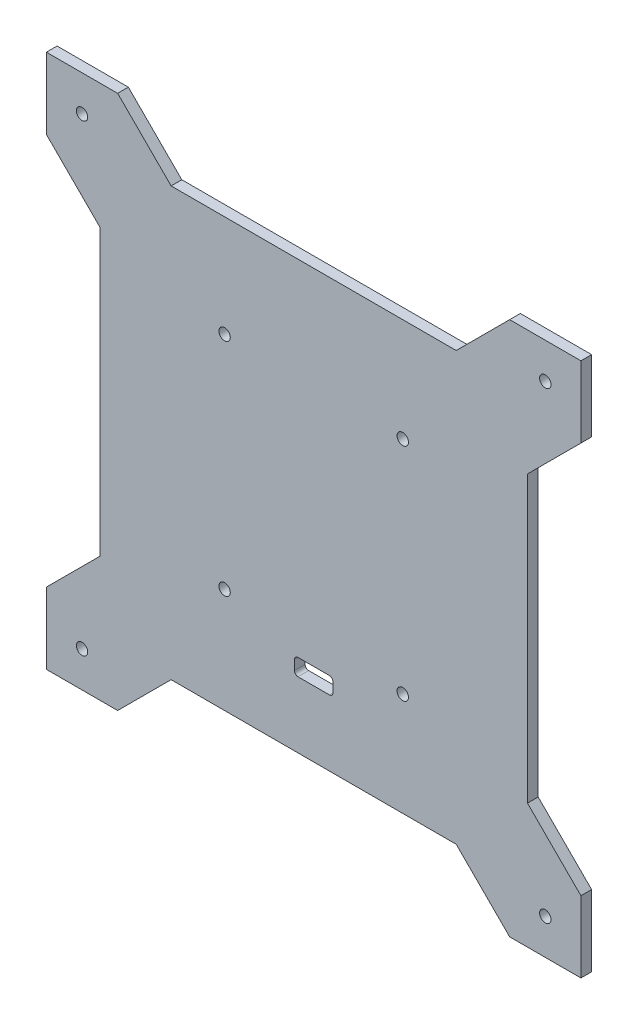
ISO-10303-21;
HEADER;
FILE_DESCRIPTION(('STEP AP214'),'2;1');
FILE_NAME('part.step','',(''),(''),'','','');
FILE_SCHEMA(('AUTOMOTIVE_DESIGN { 1 0 10303 214 1 1 1 1 }'));
ENDSEC;
DATA;
#1=APPLICATION_CONTEXT('core data for automotive mechanical design processes');
#2=APPLICATION_PROTOCOL_DEFINITION('international standard','automotive_design',2000,#1);
#3=PRODUCT_CONTEXT('',#1,'mechanical');
#4=PRODUCT('Part','Part','',(#3));
#5=PRODUCT_RELATED_PRODUCT_CATEGORY('part','',(#4));
#6=PRODUCT_DEFINITION_FORMATION('','',#4);
#7=PRODUCT_DEFINITION_CONTEXT('part definition',#1,'design');
#8=PRODUCT_DEFINITION('design','',#6,#7);
#9=PRODUCT_DEFINITION_SHAPE('','',#8);
#10=(LENGTH_UNIT() NAMED_UNIT(*) SI_UNIT(.MILLI.,.METRE.));
#11=(NAMED_UNIT(*) PLANE_ANGLE_UNIT() SI_UNIT($,.RADIAN.));
#12=(NAMED_UNIT(*) SI_UNIT($,.STERADIAN.) SOLID_ANGLE_UNIT());
#13=UNCERTAINTY_MEASURE_WITH_UNIT(LENGTH_MEASURE(1.E-05),#10,'distance_accuracy_value','');
#14=(GEOMETRIC_REPRESENTATION_CONTEXT(3) GLOBAL_UNCERTAINTY_ASSIGNED_CONTEXT((#13)) GLOBAL_UNIT_ASSIGNED_CONTEXT((#10,
#11,#12)) REPRESENTATION_CONTEXT('',''));
#15=CARTESIAN_POINT('',(0.,0.,0.));
#16=DIRECTION('',(0.,0.,1.));
#17=DIRECTION('',(1.,0.,0.));
#18=AXIS2_PLACEMENT_3D('',#15,#16,#17);
#19=CARTESIAN_POINT('',(75.,-75.,3.));
#20=DIRECTION('',(-1.,0.,0.));
#21=DIRECTION('',(0.,0.,1.));
#22=AXIS2_PLACEMENT_3D('',#19,#20,#21);
#23=PLANE('',#22);
#24=DIRECTION('',(0.,1.,0.));
#25=VECTOR('',#24,1.);
#26=CARTESIAN_POINT('',(75.,-75.,0.));
#27=LINE('',#26,#25);
#28=CARTESIAN_POINT('',(75.,-75.,0.));
#29=VERTEX_POINT('',#28);
#30=CARTESIAN_POINT('',(75.,-55.,0.));
#31=VERTEX_POINT('',#30);
#32=EDGE_CURVE('E458',#29,#31,#27,.T.);
#33=ORIENTED_EDGE('',*,*,#32,.T.);
#34=DIRECTION('',(0.,0.,1.));
#35=VECTOR('',#34,1.);
#36=CARTESIAN_POINT('',(75.,-55.,0.));
#37=LINE('',#36,#35);
#38=CARTESIAN_POINT('',(75.,-55.,3.));
#39=VERTEX_POINT('',#38);
#40=EDGE_CURVE('E299',#31,#39,#37,.T.);
#41=ORIENTED_EDGE('',*,*,#40,.T.);
#42=DIRECTION('',(0.,1.,0.));
#43=VECTOR('',#42,1.);
#44=CARTESIAN_POINT('',(75.,-75.,3.));
#45=LINE('',#44,#43);
#46=CARTESIAN_POINT('',(75.,-75.,3.));
#47=VERTEX_POINT('',#46);
#48=EDGE_CURVE('E441',#47,#39,#45,.T.);
#49=ORIENTED_EDGE('',*,*,#48,.F.);
#50=DIRECTION('',(0.,0.,-1.));
#51=VECTOR('',#50,1.);
#52=CARTESIAN_POINT('',(75.,-75.,3.));
#53=LINE('',#52,#51);
#54=EDGE_CURVE('E457',#47,#29,#53,.T.);
#55=ORIENTED_EDGE('',*,*,#54,.T.);
#56=EDGE_LOOP('',(#33,#41,#49,#55));
#57=FACE_BOUND('',#56,.T.);
#58=ADVANCED_FACE('F35',(#57),#23,.F.);
#59=CARTESIAN_POINT('',(-75.,75.,3.));
#60=DIRECTION('',(0.,-1.,0.));
#61=DIRECTION('',(0.,0.,-1.));
#62=AXIS2_PLACEMENT_3D('',#59,#60,#61);
#63=PLANE('',#62);
#64=DIRECTION('',(-1.,0.,0.));
#65=VECTOR('',#64,1.);
#66=CARTESIAN_POINT('',(-75.,75.,0.));
#67=LINE('',#66,#65);
#68=CARTESIAN_POINT('',(75.,75.,0.));
#69=VERTEX_POINT('',#68);
#70=CARTESIAN_POINT('',(55.,75.,0.));
#71=VERTEX_POINT('',#70);
#72=EDGE_CURVE('E462',#69,#71,#67,.T.);
#73=ORIENTED_EDGE('',*,*,#72,.T.);
#74=DIRECTION('',(0.,0.,1.));
#75=VECTOR('',#74,1.);
#76=CARTESIAN_POINT('',(55.,75.,0.));
#77=LINE('',#76,#75);
#78=CARTESIAN_POINT('',(55.,75.,3.));
#79=VERTEX_POINT('',#78);
#80=EDGE_CURVE('E374',#71,#79,#77,.T.);
#81=ORIENTED_EDGE('',*,*,#80,.T.);
#82=DIRECTION('',(-1.,0.,0.));
#83=VECTOR('',#82,1.);
#84=CARTESIAN_POINT('',(-75.,75.,3.));
#85=LINE('',#84,#83);
#86=CARTESIAN_POINT('',(75.,75.,3.));
#87=VERTEX_POINT('',#86);
#88=EDGE_CURVE('E446',#87,#79,#85,.T.);
#89=ORIENTED_EDGE('',*,*,#88,.F.);
#90=DIRECTION('',(0.,0.,-1.));
#91=VECTOR('',#90,1.);
#92=CARTESIAN_POINT('',(75.,75.,3.));
#93=LINE('',#92,#91);
#94=EDGE_CURVE('E11',#87,#69,#93,.T.);
#95=ORIENTED_EDGE('',*,*,#94,.T.);
#96=EDGE_LOOP('',(#73,#81,#89,#95));
#97=FACE_BOUND('',#96,.T.);
#98=ADVANCED_FACE('F512',(#97),#63,.F.);
#99=CARTESIAN_POINT('',(-75.,-75.,3.));
#100=DIRECTION('',(1.,0.,0.));
#101=DIRECTION('',(0.,0.,-1.));
#102=AXIS2_PLACEMENT_3D('',#99,#100,#101);
#103=PLANE('',#102);
#104=DIRECTION('',(0.,-1.,0.));
#105=VECTOR('',#104,1.);
#106=CARTESIAN_POINT('',(-75.,-75.,0.));
#107=LINE('',#106,#105);
#108=CARTESIAN_POINT('',(-75.,75.,0.));
#109=VERTEX_POINT('',#108);
#110=CARTESIAN_POINT('',(-75.,55.,0.));
#111=VERTEX_POINT('',#110);
#112=EDGE_CURVE('E466',#109,#111,#107,.T.);
#113=ORIENTED_EDGE('',*,*,#112,.T.);
#114=DIRECTION('',(0.,0.,1.));
#115=VECTOR('',#114,1.);
#116=CARTESIAN_POINT('',(-75.,55.,0.));
#117=LINE('',#116,#115);
#118=CARTESIAN_POINT('',(-75.,55.,3.));
#119=VERTEX_POINT('',#118);
#120=EDGE_CURVE('E303',#111,#119,#117,.T.);
#121=ORIENTED_EDGE('',*,*,#120,.T.);
#122=DIRECTION('',(0.,-1.,0.));
#123=VECTOR('',#122,1.);
#124=CARTESIAN_POINT('',(-75.,-75.,3.));
#125=LINE('',#124,#123);
#126=CARTESIAN_POINT('',(-75.,75.,3.));
#127=VERTEX_POINT('',#126);
#128=EDGE_CURVE('E450',#127,#119,#125,.T.);
#129=ORIENTED_EDGE('',*,*,#128,.F.);
#130=DIRECTION('',(0.,0.,-1.));
#131=VECTOR('',#130,1.);
#132=CARTESIAN_POINT('',(-75.,75.,3.));
#133=LINE('',#132,#131);
#134=EDGE_CURVE('E43',#127,#109,#133,.T.);
#135=ORIENTED_EDGE('',*,*,#134,.T.);
#136=EDGE_LOOP('',(#113,#121,#129,#135));
#137=FACE_BOUND('',#136,.T.);
#138=ADVANCED_FACE('F482',(#137),#103,.F.);
#139=CARTESIAN_POINT('',(-75.,-75.,3.));
#140=DIRECTION('',(0.,1.,0.));
#141=DIRECTION('',(0.,0.,1.));
#142=AXIS2_PLACEMENT_3D('',#139,#140,#141);
#143=PLANE('',#142);
#144=DIRECTION('',(1.,0.,0.));
#145=VECTOR('',#144,1.);
#146=CARTESIAN_POINT('',(-75.,-75.,0.));
#147=LINE('',#146,#145);
#148=CARTESIAN_POINT('',(-75.,-75.,0.));
#149=VERTEX_POINT('',#148);
#150=CARTESIAN_POINT('',(-55.,-75.,0.));
#151=VERTEX_POINT('',#150);
#152=EDGE_CURVE('E470',#149,#151,#147,.T.);
#153=ORIENTED_EDGE('',*,*,#152,.T.);
#154=DIRECTION('',(0.,0.,1.));
#155=VECTOR('',#154,1.);
#156=CARTESIAN_POINT('',(-55.,-75.,0.));
#157=LINE('',#156,#155);
#158=CARTESIAN_POINT('',(-55.,-75.,3.));
#159=VERTEX_POINT('',#158);
#160=EDGE_CURVE('E353',#151,#159,#157,.T.);
#161=ORIENTED_EDGE('',*,*,#160,.T.);
#162=DIRECTION('',(1.,0.,0.));
#163=VECTOR('',#162,1.);
#164=CARTESIAN_POINT('',(-75.,-75.,3.));
#165=LINE('',#164,#163);
#166=CARTESIAN_POINT('',(-75.,-75.,3.));
#167=VERTEX_POINT('',#166);
#168=EDGE_CURVE('E454',#167,#159,#165,.T.);
#169=ORIENTED_EDGE('',*,*,#168,.F.);
#170=DIRECTION('',(0.,0.,-1.));
#171=VECTOR('',#170,1.);
#172=CARTESIAN_POINT('',(-75.,-75.,3.));
#173=LINE('',#172,#171);
#174=EDGE_CURVE('E475',#167,#149,#173,.T.);
#175=ORIENTED_EDGE('',*,*,#174,.T.);
#176=EDGE_LOOP('',(#153,#161,#169,#175));
#177=FACE_BOUND('',#176,.T.);
#178=ADVANCED_FACE('F552',(#177),#143,.F.);
#179=CARTESIAN_POINT('',(0.,0.,3.));
#180=DIRECTION('',(0.,0.,-1.));
#181=DIRECTION('',(-1.,0.,0.));
#182=AXIS2_PLACEMENT_3D('',#179,#180,#181);
#183=PLANE('',#182);
#184=DIRECTION('',(1.,0.,0.));
#185=VECTOR('',#184,1.);
#186=CARTESIAN_POINT('',(4.40000000000002,-41.4873019237292,3.));
#187=LINE('',#186,#185);
#188=CARTESIAN_POINT('',(-4.39999999999998,-41.4873019237292,3.));
#189=VERTEX_POINT('',#188);
#190=CARTESIAN_POINT('',(4.40000000000002,-41.4873019237292,3.));
#191=VERTEX_POINT('',#190);
#192=EDGE_CURVE('E259',#189,#191,#187,.T.);
#193=ORIENTED_EDGE('',*,*,#192,.F.);
#194=CARTESIAN_POINT('',(-4.39999999999998,-40.4873019237292,3.));
#195=DIRECTION('',(0.,0.,1.));
#196=DIRECTION('',(1.,0.,0.));
#197=AXIS2_PLACEMENT_3D('',#194,#195,#196);
#198=CIRCLE('',#197,1.);
#199=CARTESIAN_POINT('',(-5.39999999999998,-40.4873019237292,3.));
#200=VERTEX_POINT('',#199);
#201=EDGE_CURVE('E50',#200,#189,#198,.T.);
#202=ORIENTED_EDGE('',*,*,#201,.F.);
#203=DIRECTION('',(0.,-1.,0.));
#204=VECTOR('',#203,1.);
#205=CARTESIAN_POINT('',(-5.39999999999998,-40.4873019237292,3.));
#206=LINE('',#205,#204);
#207=CARTESIAN_POINT('',(-5.39999999999998,-37.7873019237292,3.));
#208=VERTEX_POINT('',#207);
#209=EDGE_CURVE('E239',#208,#200,#206,.T.);
#210=ORIENTED_EDGE('',*,*,#209,.F.);
#211=CARTESIAN_POINT('',(-4.39999999999998,-37.7873019237292,3.));
#212=DIRECTION('',(0.,0.,1.));
#213=DIRECTION('',(1.,0.,0.));
#214=AXIS2_PLACEMENT_3D('',#211,#212,#213);
#215=CIRCLE('',#214,1.);
#216=CARTESIAN_POINT('',(-4.39999999999998,-36.7873019237292,3.));
#217=VERTEX_POINT('',#216);
#218=EDGE_CURVE('E242',#217,#208,#215,.T.);
#219=ORIENTED_EDGE('',*,*,#218,.F.);
#220=DIRECTION('',(-1.,0.,0.));
#221=VECTOR('',#220,1.);
#222=CARTESIAN_POINT('',(-4.39999999999998,-36.7873019237292,3.));
#223=LINE('',#222,#221);
#224=CARTESIAN_POINT('',(4.40000000000002,-36.7873019237292,3.));
#225=VERTEX_POINT('',#224);
#226=EDGE_CURVE('E270',#225,#217,#223,.T.);
#227=ORIENTED_EDGE('',*,*,#226,.F.);
#228=CARTESIAN_POINT('',(4.40000000000002,-37.7873019237292,3.));
#229=DIRECTION('',(0.,0.,1.));
#230=DIRECTION('',(1.,0.,0.));
#231=AXIS2_PLACEMENT_3D('',#228,#229,#230);
#232=CIRCLE('',#231,1.);
#233=CARTESIAN_POINT('',(5.40000000000002,-37.7873019237292,3.));
#234=VERTEX_POINT('',#233);
#235=EDGE_CURVE('E267',#234,#225,#232,.T.);
#236=ORIENTED_EDGE('',*,*,#235,.F.);
#237=DIRECTION('',(0.,1.,0.));
#238=VECTOR('',#237,1.);
#239=CARTESIAN_POINT('',(5.40000000000002,-37.7873019237292,3.));
#240=LINE('',#239,#238);
#241=CARTESIAN_POINT('',(5.40000000000002,-40.4873019237292,3.));
#242=VERTEX_POINT('',#241);
#243=EDGE_CURVE('E264',#242,#234,#240,.T.);
#244=ORIENTED_EDGE('',*,*,#243,.F.);
#245=CARTESIAN_POINT('',(4.40000000000002,-40.4873019237292,3.));
#246=DIRECTION('',(0.,0.,1.));
#247=DIRECTION('',(1.,0.,0.));
#248=AXIS2_PLACEMENT_3D('',#245,#246,#247);
#249=CIRCLE('',#248,1.);
#250=EDGE_CURVE('E261',#191,#242,#249,.T.);
#251=ORIENTED_EDGE('',*,*,#250,.F.);
#252=EDGE_LOOP('',(#193,#202,#210,#219,#227,#236,#244,#251));
#253=FACE_BOUND('',#252,.T.);
#254=CARTESIAN_POINT('',(-25.,31.4660394310522,3.));
#255=DIRECTION('',(0.,0.,1.));
#256=DIRECTION('',(1.,0.,0.));
#257=AXIS2_PLACEMENT_3D('',#254,#255,#256);
#258=CIRCLE('',#257,1.6);
#259=CARTESIAN_POINT('',(-23.4,31.4660394310522,3.));
#260=VERTEX_POINT('',#259);
#261=EDGE_CURVE('E371',#260,#260,#258,.T.);
#262=ORIENTED_EDGE('',*,*,#261,.F.);
#263=EDGE_LOOP('',(#262));
#264=FACE_BOUND('',#263,.T.);
#265=CARTESIAN_POINT('',(25.,31.0000000000001,3.));
#266=DIRECTION('',(0.,0.,1.));
#267=DIRECTION('',(1.,0.,0.));
#268=AXIS2_PLACEMENT_3D('',#265,#266,#267);
#269=CIRCLE('',#268,1.6);
#270=CARTESIAN_POINT('',(26.6,31.0000000000001,3.));
#271=VERTEX_POINT('',#270);
#272=EDGE_CURVE('E370',#271,#271,#269,.T.);
#273=ORIENTED_EDGE('',*,*,#272,.F.);
#274=EDGE_LOOP('',(#273));
#275=FACE_BOUND('',#274,.T.);
#276=CARTESIAN_POINT('',(25.,-30.9999999999999,3.));
#277=DIRECTION('',(0.,0.,1.));
#278=DIRECTION('',(1.,0.,0.));
#279=AXIS2_PLACEMENT_3D('',#276,#277,#278);
#280=CIRCLE('',#279,1.6);
#281=CARTESIAN_POINT('',(26.6,-30.9999999999999,3.));
#282=VERTEX_POINT('',#281);
#283=EDGE_CURVE('E403',#282,#282,#280,.T.);
#284=ORIENTED_EDGE('',*,*,#283,.F.);
#285=EDGE_LOOP('',(#284));
#286=FACE_BOUND('',#285,.T.);
#287=CARTESIAN_POINT('',(-25.,-30.5052227269584,3.));
#288=DIRECTION('',(0.,0.,1.));
#289=DIRECTION('',(1.,0.,0.));
#290=AXIS2_PLACEMENT_3D('',#287,#288,#289);
#291=CIRCLE('',#290,1.6);
#292=CARTESIAN_POINT('',(-23.4,-30.5052227269584,3.));
#293=VERTEX_POINT('',#292);
#294=EDGE_CURVE('E402',#293,#293,#291,.T.);
#295=ORIENTED_EDGE('',*,*,#294,.F.);
#296=EDGE_LOOP('',(#295));
#297=FACE_BOUND('',#296,.T.);
#298=ORIENTED_EDGE('',*,*,#88,.T.);
#299=DIRECTION('',(0.707106781186546,0.707106781186549,0.));
#300=VECTOR('',#299,1.);
#301=CARTESIAN_POINT('',(40.0000000000001,60.,3.));
#302=LINE('',#301,#300);
#303=CARTESIAN_POINT('',(40.0000000000001,60.,3.));
#304=VERTEX_POINT('',#303);
#305=EDGE_CURVE('E379',#304,#79,#302,.T.);
#306=ORIENTED_EDGE('',*,*,#305,.F.);
#307=DIRECTION('',(1.,0.,0.));
#308=VECTOR('',#307,1.);
#309=CARTESIAN_POINT('',(-40.,60.,3.));
#310=LINE('',#309,#308);
#311=CARTESIAN_POINT('',(-40.,60.,3.));
#312=VERTEX_POINT('',#311);
#313=EDGE_CURVE('E388',#312,#304,#310,.T.);
#314=ORIENTED_EDGE('',*,*,#313,.F.);
#315=DIRECTION('',(0.707106781186546,-0.707106781186549,0.));
#316=VECTOR('',#315,1.);
#317=CARTESIAN_POINT('',(-55.,75.,3.));
#318=LINE('',#317,#316);
#319=CARTESIAN_POINT('',(-55.,75.,3.));
#320=VERTEX_POINT('',#319);
#321=EDGE_CURVE('E310',#320,#312,#318,.T.);
#322=ORIENTED_EDGE('',*,*,#321,.F.);
#323=EDGE_CURVE('E444',#320,#127,#85,.T.);
#324=ORIENTED_EDGE('',*,*,#323,.T.);
#325=ORIENTED_EDGE('',*,*,#128,.T.);
#326=DIRECTION('',(-0.707106781186548,0.707106781186547,0.));
#327=VECTOR('',#326,1.);
#328=CARTESIAN_POINT('',(-60.,40.0000000000001,3.));
#329=LINE('',#328,#327);
#330=CARTESIAN_POINT('',(-60.,40.0000000000001,3.));
#331=VERTEX_POINT('',#330);
#332=EDGE_CURVE('E321',#331,#119,#329,.T.);
#333=ORIENTED_EDGE('',*,*,#332,.F.);
#334=DIRECTION('',(0.,1.,0.));
#335=VECTOR('',#334,1.);
#336=CARTESIAN_POINT('',(-60.,-40.,3.));
#337=LINE('',#336,#335);
#338=CARTESIAN_POINT('',(-60.,-40.,3.));
#339=VERTEX_POINT('',#338);
#340=EDGE_CURVE('E331',#339,#331,#337,.T.);
#341=ORIENTED_EDGE('',*,*,#340,.F.);
#342=DIRECTION('',(0.707106781186549,0.707106781186546,0.));
#343=VECTOR('',#342,1.);
#344=CARTESIAN_POINT('',(-75.,-55.,3.));
#345=LINE('',#344,#343);
#346=CARTESIAN_POINT('',(-75.,-55.,3.));
#347=VERTEX_POINT('',#346);
#348=EDGE_CURVE('E328',#347,#339,#345,.T.);
#349=ORIENTED_EDGE('',*,*,#348,.F.);
#350=EDGE_CURVE('E449',#347,#167,#125,.T.);
#351=ORIENTED_EDGE('',*,*,#350,.T.);
#352=ORIENTED_EDGE('',*,*,#168,.T.);
#353=DIRECTION('',(-0.707106781186546,-0.707106781186549,0.));
#354=VECTOR('',#353,1.);
#355=CARTESIAN_POINT('',(-55.,-75.,3.));
#356=LINE('',#355,#354);
#357=CARTESIAN_POINT('',(-40.,-60.,3.));
#358=VERTEX_POINT('',#357);
#359=EDGE_CURVE('E277',#358,#159,#356,.T.);
#360=ORIENTED_EDGE('',*,*,#359,.F.);
#361=DIRECTION('',(-1.,0.,0.));
#362=VECTOR('',#361,1.);
#363=CARTESIAN_POINT('',(-40.,-60.,3.));
#364=LINE('',#363,#362);
#365=CARTESIAN_POINT('',(40.0000000000001,-60.,3.));
#366=VERTEX_POINT('',#365);
#367=EDGE_CURVE('E347',#366,#358,#364,.T.);
#368=ORIENTED_EDGE('',*,*,#367,.F.);
#369=DIRECTION('',(-0.707106781186547,0.707106781186549,0.));
#370=VECTOR('',#369,1.);
#371=CARTESIAN_POINT('',(40.0000000000001,-60.,3.));
#372=LINE('',#371,#370);
#373=CARTESIAN_POINT('',(55.,-74.9999999999999,3.));
#374=VERTEX_POINT('',#373);
#375=EDGE_CURVE('E355',#374,#366,#372,.T.);
#376=ORIENTED_EDGE('',*,*,#375,.F.);
#377=EDGE_CURVE('E453',#374,#47,#165,.T.);
#378=ORIENTED_EDGE('',*,*,#377,.T.);
#379=ORIENTED_EDGE('',*,*,#48,.T.);
#380=DIRECTION('',(0.707106781186548,-0.707106781186547,0.));
#381=VECTOR('',#380,1.);
#382=CARTESIAN_POINT('',(75.,-55.,3.));
#383=LINE('',#382,#381);
#384=CARTESIAN_POINT('',(60.,-40.,3.));
#385=VERTEX_POINT('',#384);
#386=EDGE_CURVE('E300',#385,#39,#383,.T.);
#387=ORIENTED_EDGE('',*,*,#386,.F.);
#388=DIRECTION('',(0.,-1.,0.));
#389=VECTOR('',#388,1.);
#390=CARTESIAN_POINT('',(60.,-40.,3.));
#391=LINE('',#390,#389);
#392=CARTESIAN_POINT('',(60.,40.0000000000001,3.));
#393=VERTEX_POINT('',#392);
#394=EDGE_CURVE('E293',#393,#385,#391,.T.);
#395=ORIENTED_EDGE('',*,*,#394,.F.);
#396=DIRECTION('',(-0.707106781186549,-0.707106781186547,0.));
#397=VECTOR('',#396,1.);
#398=CARTESIAN_POINT('',(60.,40.0000000000001,3.));
#399=LINE('',#398,#397);
#400=CARTESIAN_POINT('',(75.,55.,3.));
#401=VERTEX_POINT('',#400);
#402=EDGE_CURVE('E302',#401,#393,#399,.T.);
#403=ORIENTED_EDGE('',*,*,#402,.F.);
#404=EDGE_CURVE('E445',#401,#87,#45,.T.);
#405=ORIENTED_EDGE('',*,*,#404,.T.);
#406=EDGE_LOOP('',(#298,#306,#314,#322,#324,#325,#333,#341,#349,#351,#352,#360,#368,#376,#378,
#379,#387,#395,#403,#405));
#407=FACE_BOUND('',#406,.T.);
#408=CARTESIAN_POINT('',(-65.,65.,3.));
#409=DIRECTION('',(0.,0.,1.));
#410=DIRECTION('',(1.,0.,0.));
#411=AXIS2_PLACEMENT_3D('',#408,#409,#410);
#412=CIRCLE('',#411,1.60000000000001);
#413=CARTESIAN_POINT('',(-63.4,65.,3.));
#414=VERTEX_POINT('',#413);
#415=EDGE_CURVE('E435',#414,#414,#412,.T.);
#416=ORIENTED_EDGE('',*,*,#415,.F.);
#417=EDGE_LOOP('',(#416));
#418=FACE_BOUND('',#417,.T.);
#419=CARTESIAN_POINT('',(65.,65.,3.));
#420=DIRECTION('',(0.,0.,1.));
#421=DIRECTION('',(1.,0.,0.));
#422=AXIS2_PLACEMENT_3D('',#419,#420,#421);
#423=CIRCLE('',#422,1.60000000000001);
#424=CARTESIAN_POINT('',(66.6,65.,3.));
#425=VERTEX_POINT('',#424);
#426=EDGE_CURVE('E429',#425,#425,#423,.T.);
#427=ORIENTED_EDGE('',*,*,#426,.F.);
#428=EDGE_LOOP('',(#427));
#429=FACE_BOUND('',#428,.T.);
#430=CARTESIAN_POINT('',(-65.,-65.,3.));
#431=DIRECTION('',(0.,0.,1.));
#432=DIRECTION('',(1.,0.,0.));
#433=AXIS2_PLACEMENT_3D('',#430,#431,#432);
#434=CIRCLE('',#433,1.60000000000001);
#435=CARTESIAN_POINT('',(-63.4,-65.,3.));
#436=VERTEX_POINT('',#435);
#437=EDGE_CURVE('E423',#436,#436,#434,.T.);
#438=ORIENTED_EDGE('',*,*,#437,.F.);
#439=EDGE_LOOP('',(#438));
#440=FACE_BOUND('',#439,.T.);
#441=CARTESIAN_POINT('',(65.,-65.,3.));
#442=DIRECTION('',(0.,0.,1.));
#443=DIRECTION('',(1.,0.,0.));
#444=AXIS2_PLACEMENT_3D('',#441,#442,#443);
#445=CIRCLE('',#444,1.60000000000001);
#446=CARTESIAN_POINT('',(66.6,-65.,3.));
#447=VERTEX_POINT('',#446);
#448=EDGE_CURVE('E417',#447,#447,#445,.T.);
#449=ORIENTED_EDGE('',*,*,#448,.F.);
#450=EDGE_LOOP('',(#449));
#451=FACE_BOUND('',#450,.T.);
#452=ADVANCED_FACE('F493',(#253,#264,#275,#286,#297,#407,#418,#429,#440,#451),#183,.F.);
#453=CARTESIAN_POINT('',(0.,0.,0.));
#454=DIRECTION('',(0.,0.,-1.));
#455=DIRECTION('',(-1.,0.,0.));
#456=AXIS2_PLACEMENT_3D('',#453,#454,#455);
#457=PLANE('',#456);
#458=CARTESIAN_POINT('',(-4.39999999999998,-40.4873019237292,0.));
#459=DIRECTION('',(0.,0.,1.));
#460=DIRECTION('',(1.,0.,0.));
#461=AXIS2_PLACEMENT_3D('',#458,#459,#460);
#462=CIRCLE('',#461,1.);
#463=CARTESIAN_POINT('',(-5.39999999999998,-40.4873019237292,0.));
#464=VERTEX_POINT('',#463);
#465=CARTESIAN_POINT('',(-4.39999999999998,-41.4873019237292,0.));
#466=VERTEX_POINT('',#465);
#467=EDGE_CURVE('E222',#464,#466,#462,.T.);
#468=ORIENTED_EDGE('',*,*,#467,.T.);
#469=DIRECTION('',(1.,0.,0.));
#470=VECTOR('',#469,1.);
#471=CARTESIAN_POINT('',(4.40000000000002,-41.4873019237292,0.));
#472=LINE('',#471,#470);
#473=CARTESIAN_POINT('',(4.40000000000002,-41.4873019237292,0.));
#474=VERTEX_POINT('',#473);
#475=EDGE_CURVE('E231',#466,#474,#472,.T.);
#476=ORIENTED_EDGE('',*,*,#475,.T.);
#477=CARTESIAN_POINT('',(4.40000000000002,-40.4873019237292,0.));
#478=DIRECTION('',(0.,0.,1.));
#479=DIRECTION('',(1.,0.,0.));
#480=AXIS2_PLACEMENT_3D('',#477,#478,#479);
#481=CIRCLE('',#480,1.);
#482=CARTESIAN_POINT('',(5.40000000000002,-40.4873019237292,0.));
#483=VERTEX_POINT('',#482);
#484=EDGE_CURVE('E58',#474,#483,#481,.T.);
#485=ORIENTED_EDGE('',*,*,#484,.T.);
#486=DIRECTION('',(0.,1.,0.));
#487=VECTOR('',#486,1.);
#488=CARTESIAN_POINT('',(5.40000000000002,-37.7873019237292,0.));
#489=LINE('',#488,#487);
#490=CARTESIAN_POINT('',(5.40000000000002,-37.7873019237292,0.));
#491=VERTEX_POINT('',#490);
#492=EDGE_CURVE('E246',#483,#491,#489,.T.);
#493=ORIENTED_EDGE('',*,*,#492,.T.);
#494=CARTESIAN_POINT('',(4.40000000000002,-37.7873019237292,0.));
#495=DIRECTION('',(0.,0.,1.));
#496=DIRECTION('',(1.,0.,0.));
#497=AXIS2_PLACEMENT_3D('',#494,#495,#496);
#498=CIRCLE('',#497,1.);
#499=CARTESIAN_POINT('',(4.40000000000002,-36.7873019237292,0.));
#500=VERTEX_POINT('',#499);
#501=EDGE_CURVE('E249',#491,#500,#498,.T.);
#502=ORIENTED_EDGE('',*,*,#501,.T.);
#503=DIRECTION('',(-1.,0.,0.));
#504=VECTOR('',#503,1.);
#505=CARTESIAN_POINT('',(-4.39999999999998,-36.7873019237292,0.));
#506=LINE('',#505,#504);
#507=CARTESIAN_POINT('',(-4.39999999999998,-36.7873019237292,0.));
#508=VERTEX_POINT('',#507);
#509=EDGE_CURVE('E252',#500,#508,#506,.T.);
#510=ORIENTED_EDGE('',*,*,#509,.T.);
#511=CARTESIAN_POINT('',(-4.39999999999998,-37.7873019237292,0.));
#512=DIRECTION('',(0.,0.,1.));
#513=DIRECTION('',(1.,0.,0.));
#514=AXIS2_PLACEMENT_3D('',#511,#512,#513);
#515=CIRCLE('',#514,1.);
#516=CARTESIAN_POINT('',(-5.39999999999998,-37.7873019237292,0.));
#517=VERTEX_POINT('',#516);
#518=EDGE_CURVE('E255',#508,#517,#515,.T.);
#519=ORIENTED_EDGE('',*,*,#518,.T.);
#520=DIRECTION('',(0.,-1.,0.));
#521=VECTOR('',#520,1.);
#522=CARTESIAN_POINT('',(-5.39999999999998,-40.4873019237292,0.));
#523=LINE('',#522,#521);
#524=EDGE_CURVE('E228',#517,#464,#523,.T.);
#525=ORIENTED_EDGE('',*,*,#524,.T.);
#526=EDGE_LOOP('',(#468,#476,#485,#493,#502,#510,#519,#525));
#527=FACE_BOUND('',#526,.T.);
#528=DIRECTION('',(0.707106781186546,0.707106781186549,0.));
#529=VECTOR('',#528,1.);
#530=CARTESIAN_POINT('',(40.0000000000001,60.,0.));
#531=LINE('',#530,#529);
#532=CARTESIAN_POINT('',(40.0000000000001,60.,0.));
#533=VERTEX_POINT('',#532);
#534=EDGE_CURVE('E382',#533,#71,#531,.T.);
#535=ORIENTED_EDGE('',*,*,#534,.T.);
#536=ORIENTED_EDGE('',*,*,#72,.F.);
#537=CARTESIAN_POINT('',(75.,55.,0.));
#538=VERTEX_POINT('',#537);
#539=EDGE_CURVE('E438',#538,#69,#27,.T.);
#540=ORIENTED_EDGE('',*,*,#539,.F.);
#541=DIRECTION('',(-0.707106781186549,-0.707106781186547,0.));
#542=VECTOR('',#541,1.);
#543=CARTESIAN_POINT('',(60.,40.0000000000001,0.));
#544=LINE('',#543,#542);
#545=CARTESIAN_POINT('',(60.,40.0000000000001,0.));
#546=VERTEX_POINT('',#545);
#547=EDGE_CURVE('E292',#538,#546,#544,.T.);
#548=ORIENTED_EDGE('',*,*,#547,.T.);
#549=DIRECTION('',(0.,-1.,0.));
#550=VECTOR('',#549,1.);
#551=CARTESIAN_POINT('',(60.,-40.,0.));
#552=LINE('',#551,#550);
#553=CARTESIAN_POINT('',(60.,-40.,0.));
#554=VERTEX_POINT('',#553);
#555=EDGE_CURVE('E296',#546,#554,#552,.T.);
#556=ORIENTED_EDGE('',*,*,#555,.T.);
#557=DIRECTION('',(0.707106781186548,-0.707106781186547,0.));
#558=VECTOR('',#557,1.);
#559=CARTESIAN_POINT('',(75.,-55.,0.));
#560=LINE('',#559,#558);
#561=EDGE_CURVE('E289',#554,#31,#560,.T.);
#562=ORIENTED_EDGE('',*,*,#561,.T.);
#563=ORIENTED_EDGE('',*,*,#32,.F.);
#564=CARTESIAN_POINT('',(55.,-75.,0.));
#565=VERTEX_POINT('',#564);
#566=EDGE_CURVE('E469',#565,#29,#147,.T.);
#567=ORIENTED_EDGE('',*,*,#566,.F.);
#568=DIRECTION('',(-0.707106781186547,0.707106781186549,0.));
#569=VECTOR('',#568,1.);
#570=CARTESIAN_POINT('',(40.0000000000001,-60.,0.));
#571=LINE('',#570,#569);
#572=CARTESIAN_POINT('',(40.0000000000001,-60.,0.));
#573=VERTEX_POINT('',#572);
#574=EDGE_CURVE('E346',#565,#573,#571,.T.);
#575=ORIENTED_EDGE('',*,*,#574,.T.);
#576=DIRECTION('',(-1.,0.,0.));
#577=VECTOR('',#576,1.);
#578=CARTESIAN_POINT('',(-40.,-60.,0.));
#579=LINE('',#578,#577);
#580=CARTESIAN_POINT('',(-40.,-60.,0.));
#581=VERTEX_POINT('',#580);
#582=EDGE_CURVE('E350',#573,#581,#579,.T.);
#583=ORIENTED_EDGE('',*,*,#582,.T.);
#584=DIRECTION('',(-0.707106781186546,-0.707106781186549,0.));
#585=VECTOR('',#584,1.);
#586=CARTESIAN_POINT('',(-55.,-75.,0.));
#587=LINE('',#586,#585);
#588=EDGE_CURVE('E343',#581,#151,#587,.T.);
#589=ORIENTED_EDGE('',*,*,#588,.T.);
#590=ORIENTED_EDGE('',*,*,#152,.F.);
#591=CARTESIAN_POINT('',(-75.,-55.,0.));
#592=VERTEX_POINT('',#591);
#593=EDGE_CURVE('E465',#592,#149,#107,.T.);
#594=ORIENTED_EDGE('',*,*,#593,.F.);
#595=DIRECTION('',(0.707106781186549,0.707106781186546,0.));
#596=VECTOR('',#595,1.);
#597=CARTESIAN_POINT('',(-75.,-55.,0.));
#598=LINE('',#597,#596);
#599=CARTESIAN_POINT('',(-60.,-40.,0.));
#600=VERTEX_POINT('',#599);
#601=EDGE_CURVE('E317',#592,#600,#598,.T.);
#602=ORIENTED_EDGE('',*,*,#601,.T.);
#603=DIRECTION('',(0.,1.,0.));
#604=VECTOR('',#603,1.);
#605=CARTESIAN_POINT('',(-60.,-40.,0.));
#606=LINE('',#605,#604);
#607=CARTESIAN_POINT('',(-60.,40.0000000000001,0.));
#608=VERTEX_POINT('',#607);
#609=EDGE_CURVE('E320',#600,#608,#606,.T.);
#610=ORIENTED_EDGE('',*,*,#609,.T.);
#611=DIRECTION('',(-0.707106781186548,0.707106781186547,0.));
#612=VECTOR('',#611,1.);
#613=CARTESIAN_POINT('',(-60.,40.0000000000001,0.));
#614=LINE('',#613,#612);
#615=EDGE_CURVE('E324',#608,#111,#614,.T.);
#616=ORIENTED_EDGE('',*,*,#615,.T.);
#617=ORIENTED_EDGE('',*,*,#112,.F.);
#618=CARTESIAN_POINT('',(-55.,75.,0.));
#619=VERTEX_POINT('',#618);
#620=EDGE_CURVE('E461',#619,#109,#67,.T.);
#621=ORIENTED_EDGE('',*,*,#620,.F.);
#622=DIRECTION('',(0.707106781186546,-0.707106781186549,0.));
#623=VECTOR('',#622,1.);
#624=CARTESIAN_POINT('',(-55.,75.,0.));
#625=LINE('',#624,#623);
#626=CARTESIAN_POINT('',(-40.,60.,0.));
#627=VERTEX_POINT('',#626);
#628=EDGE_CURVE('E375',#619,#627,#625,.T.);
#629=ORIENTED_EDGE('',*,*,#628,.T.);
#630=DIRECTION('',(1.,0.,0.));
#631=VECTOR('',#630,1.);
#632=CARTESIAN_POINT('',(-40.,60.,0.));
#633=LINE('',#632,#631);
#634=EDGE_CURVE('E378',#627,#533,#633,.T.);
#635=ORIENTED_EDGE('',*,*,#634,.T.);
#636=EDGE_LOOP('',(#535,#536,#540,#548,#556,#562,#563,#567,#575,#583,#589,#590,#594,#602,#610,
#616,#617,#621,#629,#635));
#637=FACE_BOUND('',#636,.T.);
#638=CARTESIAN_POINT('',(-25.,31.4660394310522,0.));
#639=DIRECTION('',(0.,0.,1.));
#640=DIRECTION('',(1.,0.,0.));
#641=AXIS2_PLACEMENT_3D('',#638,#639,#640);
#642=CIRCLE('',#641,1.6);
#643=CARTESIAN_POINT('',(-23.4,31.4660394310522,0.));
#644=VERTEX_POINT('',#643);
#645=EDGE_CURVE('E367',#644,#644,#642,.T.);
#646=ORIENTED_EDGE('',*,*,#645,.T.);
#647=EDGE_LOOP('',(#646));
#648=FACE_BOUND('',#647,.T.);
#649=CARTESIAN_POINT('',(25.,31.0000000000001,0.));
#650=DIRECTION('',(0.,0.,1.));
#651=DIRECTION('',(1.,0.,0.));
#652=AXIS2_PLACEMENT_3D('',#649,#650,#651);
#653=CIRCLE('',#652,1.6);
#654=CARTESIAN_POINT('',(26.6,31.0000000000001,0.));
#655=VERTEX_POINT('',#654);
#656=EDGE_CURVE('E406',#655,#655,#653,.T.);
#657=ORIENTED_EDGE('',*,*,#656,.T.);
#658=EDGE_LOOP('',(#657));
#659=FACE_BOUND('',#658,.T.);
#660=CARTESIAN_POINT('',(25.,-30.9999999999999,0.));
#661=DIRECTION('',(0.,0.,1.));
#662=DIRECTION('',(1.,0.,0.));
#663=AXIS2_PLACEMENT_3D('',#660,#661,#662);
#664=CIRCLE('',#663,1.6);
#665=CARTESIAN_POINT('',(26.6,-30.9999999999999,0.));
#666=VERTEX_POINT('',#665);
#667=EDGE_CURVE('E399',#666,#666,#664,.T.);
#668=ORIENTED_EDGE('',*,*,#667,.T.);
#669=EDGE_LOOP('',(#668));
#670=FACE_BOUND('',#669,.T.);
#671=CARTESIAN_POINT('',(-25.,-30.5052227269584,0.));
#672=DIRECTION('',(0.,0.,1.));
#673=DIRECTION('',(1.,0.,0.));
#674=AXIS2_PLACEMENT_3D('',#671,#672,#673);
#675=CIRCLE('',#674,1.6);
#676=CARTESIAN_POINT('',(-23.4,-30.5052227269584,0.));
#677=VERTEX_POINT('',#676);
#678=EDGE_CURVE('E411',#677,#677,#675,.T.);
#679=ORIENTED_EDGE('',*,*,#678,.T.);
#680=EDGE_LOOP('',(#679));
#681=FACE_BOUND('',#680,.T.);
#682=CARTESIAN_POINT('',(-65.,-65.,0.));
#683=DIRECTION('',(0.,0.,1.));
#684=DIRECTION('',(1.,0.,0.));
#685=AXIS2_PLACEMENT_3D('',#682,#683,#684);
#686=CIRCLE('',#685,1.60000000000001);
#687=CARTESIAN_POINT('',(-63.4,-65.,0.));
#688=VERTEX_POINT('',#687);
#689=EDGE_CURVE('E420',#688,#688,#686,.T.);
#690=ORIENTED_EDGE('',*,*,#689,.T.);
#691=EDGE_LOOP('',(#690));
#692=FACE_BOUND('',#691,.T.);
#693=CARTESIAN_POINT('',(-65.,65.,0.));
#694=DIRECTION('',(0.,0.,1.));
#695=DIRECTION('',(1.,0.,0.));
#696=AXIS2_PLACEMENT_3D('',#693,#694,#695);
#697=CIRCLE('',#696,1.60000000000001);
#698=CARTESIAN_POINT('',(-63.4,65.,0.));
#699=VERTEX_POINT('',#698);
#700=EDGE_CURVE('E432',#699,#699,#697,.T.);
#701=ORIENTED_EDGE('',*,*,#700,.T.);
#702=EDGE_LOOP('',(#701));
#703=FACE_BOUND('',#702,.T.);
#704=CARTESIAN_POINT('',(65.,65.,0.));
#705=DIRECTION('',(0.,0.,1.));
#706=DIRECTION('',(1.,0.,0.));
#707=AXIS2_PLACEMENT_3D('',#704,#705,#706);
#708=CIRCLE('',#707,1.60000000000001);
#709=CARTESIAN_POINT('',(66.6,65.,0.));
#710=VERTEX_POINT('',#709);
#711=EDGE_CURVE('E426',#710,#710,#708,.T.);
#712=ORIENTED_EDGE('',*,*,#711,.T.);
#713=EDGE_LOOP('',(#712));
#714=FACE_BOUND('',#713,.T.);
#715=CARTESIAN_POINT('',(65.,-65.,0.));
#716=DIRECTION('',(0.,0.,1.));
#717=DIRECTION('',(1.,0.,0.));
#718=AXIS2_PLACEMENT_3D('',#715,#716,#717);
#719=CIRCLE('',#718,1.60000000000001);
#720=CARTESIAN_POINT('',(66.6,-65.,0.));
#721=VERTEX_POINT('',#720);
#722=EDGE_CURVE('E414',#721,#721,#719,.T.);
#723=ORIENTED_EDGE('',*,*,#722,.T.);
#724=EDGE_LOOP('',(#723));
#725=FACE_BOUND('',#724,.T.);
#726=ADVANCED_FACE('F235',(#527,#637,#648,#659,#670,#681,#692,#703,#714,#725),#457,.T.);
#727=ORIENTED_EDGE('',*,*,#404,.F.);
#728=DIRECTION('',(0.,0.,1.));
#729=VECTOR('',#728,1.);
#730=CARTESIAN_POINT('',(75.,55.,0.));
#731=LINE('',#730,#729);
#732=EDGE_CURVE('E313',#538,#401,#731,.T.);
#733=ORIENTED_EDGE('',*,*,#732,.F.);
#734=ORIENTED_EDGE('',*,*,#539,.T.);
#735=ORIENTED_EDGE('',*,*,#94,.F.);
#736=EDGE_LOOP('',(#727,#733,#734,#735));
#737=FACE_BOUND('',#736,.T.);
#738=ADVANCED_FACE('F37',(#737),#23,.F.);
#739=ORIENTED_EDGE('',*,*,#323,.F.);
#740=DIRECTION('',(0.,0.,1.));
#741=VECTOR('',#740,1.);
#742=CARTESIAN_POINT('',(-55.,75.,0.));
#743=LINE('',#742,#741);
#744=EDGE_CURVE('E385',#619,#320,#743,.T.);
#745=ORIENTED_EDGE('',*,*,#744,.F.);
#746=ORIENTED_EDGE('',*,*,#620,.T.);
#747=ORIENTED_EDGE('',*,*,#134,.F.);
#748=EDGE_LOOP('',(#739,#745,#746,#747));
#749=FACE_BOUND('',#748,.T.);
#750=ADVANCED_FACE('F499',(#749),#63,.F.);
#751=ORIENTED_EDGE('',*,*,#350,.F.);
#752=DIRECTION('',(0.,0.,1.));
#753=VECTOR('',#752,1.);
#754=CARTESIAN_POINT('',(-75.,-55.,0.));
#755=LINE('',#754,#753);
#756=EDGE_CURVE('E327',#592,#347,#755,.T.);
#757=ORIENTED_EDGE('',*,*,#756,.F.);
#758=ORIENTED_EDGE('',*,*,#593,.T.);
#759=ORIENTED_EDGE('',*,*,#174,.F.);
#760=EDGE_LOOP('',(#751,#757,#758,#759));
#761=FACE_BOUND('',#760,.T.);
#762=ADVANCED_FACE('F557',(#761),#103,.F.);
#763=ORIENTED_EDGE('',*,*,#377,.F.);
#764=DIRECTION('',(0.,0.,1.));
#765=VECTOR('',#764,1.);
#766=CARTESIAN_POINT('',(55.,-74.9999999999999,0.));
#767=LINE('',#766,#765);
#768=EDGE_CURVE('E363',#565,#374,#767,.T.);
#769=ORIENTED_EDGE('',*,*,#768,.F.);
#770=ORIENTED_EDGE('',*,*,#566,.T.);
#771=ORIENTED_EDGE('',*,*,#54,.F.);
#772=EDGE_LOOP('',(#763,#769,#770,#771));
#773=FACE_BOUND('',#772,.T.);
#774=ADVANCED_FACE('F536',(#773),#143,.F.);
#775=CARTESIAN_POINT('',(-65.,65.,3.));
#776=DIRECTION('',(0.,0.,-1.));
#777=DIRECTION('',(-1.,0.,0.));
#778=AXIS2_PLACEMENT_3D('',#775,#776,#777);
#779=CYLINDRICAL_SURFACE('',#778,1.60000000000001);
#780=ORIENTED_EDGE('',*,*,#415,.T.);
#781=EDGE_LOOP('',(#780));
#782=FACE_BOUND('',#781,.T.);
#783=ORIENTED_EDGE('',*,*,#700,.F.);
#784=EDGE_LOOP('',(#783));
#785=FACE_BOUND('',#784,.T.);
#786=ADVANCED_FACE('F592',(#782,#785),#779,.F.);
#787=CARTESIAN_POINT('',(65.,65.,3.));
#788=DIRECTION('',(0.,0.,-1.));
#789=DIRECTION('',(-1.,0.,0.));
#790=AXIS2_PLACEMENT_3D('',#787,#788,#789);
#791=CYLINDRICAL_SURFACE('',#790,1.60000000000001);
#792=ORIENTED_EDGE('',*,*,#426,.T.);
#793=EDGE_LOOP('',(#792));
#794=FACE_BOUND('',#793,.T.);
#795=ORIENTED_EDGE('',*,*,#711,.F.);
#796=EDGE_LOOP('',(#795));
#797=FACE_BOUND('',#796,.T.);
#798=ADVANCED_FACE('F640',(#794,#797),#791,.F.);
#799=CARTESIAN_POINT('',(-65.,-65.,3.));
#800=DIRECTION('',(0.,0.,-1.));
#801=DIRECTION('',(-1.,0.,0.));
#802=AXIS2_PLACEMENT_3D('',#799,#800,#801);
#803=CYLINDRICAL_SURFACE('',#802,1.60000000000001);
#804=ORIENTED_EDGE('',*,*,#437,.T.);
#805=EDGE_LOOP('',(#804));
#806=FACE_BOUND('',#805,.T.);
#807=ORIENTED_EDGE('',*,*,#689,.F.);
#808=EDGE_LOOP('',(#807));
#809=FACE_BOUND('',#808,.T.);
#810=ADVANCED_FACE('F648',(#806,#809),#803,.F.);
#811=CARTESIAN_POINT('',(65.,-65.,3.));
#812=DIRECTION('',(0.,0.,-1.));
#813=DIRECTION('',(-1.,0.,0.));
#814=AXIS2_PLACEMENT_3D('',#811,#812,#813);
#815=CYLINDRICAL_SURFACE('',#814,1.60000000000001);
#816=ORIENTED_EDGE('',*,*,#448,.T.);
#817=EDGE_LOOP('',(#816));
#818=FACE_BOUND('',#817,.T.);
#819=ORIENTED_EDGE('',*,*,#722,.F.);
#820=EDGE_LOOP('',(#819));
#821=FACE_BOUND('',#820,.T.);
#822=ADVANCED_FACE('F657',(#818,#821),#815,.F.);
#823=CARTESIAN_POINT('',(-55.,-75.,0.));
#824=DIRECTION('',(-0.707106781186549,0.707106781186546,0.));
#825=DIRECTION('',(-0.707106781186546,-0.707106781186549,0.));
#826=AXIS2_PLACEMENT_3D('',#823,#824,#825);
#827=PLANE('',#826);
#828=ORIENTED_EDGE('',*,*,#359,.T.);
#829=ORIENTED_EDGE('',*,*,#160,.F.);
#830=ORIENTED_EDGE('',*,*,#588,.F.);
#831=DIRECTION('',(0.,0.,1.));
#832=VECTOR('',#831,1.);
#833=CARTESIAN_POINT('',(-40.,-60.,0.));
#834=LINE('',#833,#832);
#835=EDGE_CURVE('E332',#581,#358,#834,.T.);
#836=ORIENTED_EDGE('',*,*,#835,.T.);
#837=EDGE_LOOP('',(#828,#829,#830,#836));
#838=FACE_BOUND('',#837,.T.);
#839=ADVANCED_FACE('F548',(#838),#827,.F.);
#840=CARTESIAN_POINT('',(-40.,-60.,0.));
#841=DIRECTION('',(0.,1.,0.));
#842=DIRECTION('',(-1.,0.,0.));
#843=AXIS2_PLACEMENT_3D('',#840,#841,#842);
#844=PLANE('',#843);
#845=ORIENTED_EDGE('',*,*,#367,.T.);
#846=ORIENTED_EDGE('',*,*,#835,.F.);
#847=ORIENTED_EDGE('',*,*,#582,.F.);
#848=DIRECTION('',(0.,0.,1.));
#849=VECTOR('',#848,1.);
#850=CARTESIAN_POINT('',(40.0000000000001,-60.,0.));
#851=LINE('',#850,#849);
#852=EDGE_CURVE('E361',#573,#366,#851,.T.);
#853=ORIENTED_EDGE('',*,*,#852,.T.);
#854=EDGE_LOOP('',(#845,#846,#847,#853));
#855=FACE_BOUND('',#854,.T.);
#856=ADVANCED_FACE('F544',(#855),#844,.F.);
#857=CARTESIAN_POINT('',(40.0000000000001,-60.,0.));
#858=DIRECTION('',(0.707106781186548,0.707106781186546,0.));
#859=DIRECTION('',(-0.707106781186547,0.707106781186549,0.));
#860=AXIS2_PLACEMENT_3D('',#857,#858,#859);
#861=PLANE('',#860);
#862=ORIENTED_EDGE('',*,*,#375,.T.);
#863=ORIENTED_EDGE('',*,*,#852,.F.);
#864=ORIENTED_EDGE('',*,*,#574,.F.);
#865=ORIENTED_EDGE('',*,*,#768,.T.);
#866=EDGE_LOOP('',(#862,#863,#864,#865));
#867=FACE_BOUND('',#866,.T.);
#868=ADVANCED_FACE('F540',(#867),#861,.F.);
#869=CARTESIAN_POINT('',(-60.,40.0000000000001,0.));
#870=DIRECTION('',(0.707106781186547,0.707106781186548,0.));
#871=DIRECTION('',(-0.707106781186548,0.707106781186547,0.));
#872=AXIS2_PLACEMENT_3D('',#869,#870,#871);
#873=PLANE('',#872);
#874=ORIENTED_EDGE('',*,*,#332,.T.);
#875=ORIENTED_EDGE('',*,*,#120,.F.);
#876=ORIENTED_EDGE('',*,*,#615,.F.);
#877=DIRECTION('',(0.,0.,1.));
#878=VECTOR('',#877,1.);
#879=CARTESIAN_POINT('',(-60.,40.0000000000001,0.));
#880=LINE('',#879,#878);
#881=EDGE_CURVE('E338',#608,#331,#880,.T.);
#882=ORIENTED_EDGE('',*,*,#881,.T.);
#883=EDGE_LOOP('',(#874,#875,#876,#882));
#884=FACE_BOUND('',#883,.T.);
#885=ADVANCED_FACE('F490',(#884),#873,.F.);
#886=CARTESIAN_POINT('',(-60.,-40.,0.));
#887=DIRECTION('',(1.,0.,0.));
#888=DIRECTION('',(0.,1.,0.));
#889=AXIS2_PLACEMENT_3D('',#886,#887,#888);
#890=PLANE('',#889);
#891=ORIENTED_EDGE('',*,*,#340,.T.);
#892=ORIENTED_EDGE('',*,*,#881,.F.);
#893=ORIENTED_EDGE('',*,*,#609,.F.);
#894=DIRECTION('',(0.,0.,1.));
#895=VECTOR('',#894,1.);
#896=CARTESIAN_POINT('',(-60.,-40.,0.));
#897=LINE('',#896,#895);
#898=EDGE_CURVE('E340',#600,#339,#897,.T.);
#899=ORIENTED_EDGE('',*,*,#898,.T.);
#900=EDGE_LOOP('',(#891,#892,#893,#899));
#901=FACE_BOUND('',#900,.T.);
#902=ADVANCED_FACE('F563',(#901),#890,.F.);
#903=CARTESIAN_POINT('',(-75.,-55.,0.));
#904=DIRECTION('',(0.707106781186546,-0.707106781186548,0.));
#905=DIRECTION('',(0.707106781186549,0.707106781186546,0.));
#906=AXIS2_PLACEMENT_3D('',#903,#904,#905);
#907=PLANE('',#906);
#908=ORIENTED_EDGE('',*,*,#348,.T.);
#909=ORIENTED_EDGE('',*,*,#898,.F.);
#910=ORIENTED_EDGE('',*,*,#601,.F.);
#911=ORIENTED_EDGE('',*,*,#756,.T.);
#912=EDGE_LOOP('',(#908,#909,#910,#911));
#913=FACE_BOUND('',#912,.T.);
#914=ADVANCED_FACE('F560',(#913),#907,.F.);
#915=CARTESIAN_POINT('',(40.0000000000001,60.,0.));
#916=DIRECTION('',(0.707106781186549,-0.707106781186546,0.));
#917=DIRECTION('',(0.707106781186546,0.707106781186549,0.));
#918=AXIS2_PLACEMENT_3D('',#915,#916,#917);
#919=PLANE('',#918);
#920=ORIENTED_EDGE('',*,*,#305,.T.);
#921=ORIENTED_EDGE('',*,*,#80,.F.);
#922=ORIENTED_EDGE('',*,*,#534,.F.);
#923=DIRECTION('',(0.,0.,1.));
#924=VECTOR('',#923,1.);
#925=CARTESIAN_POINT('',(40.0000000000001,60.,0.));
#926=LINE('',#925,#924);
#927=EDGE_CURVE('E394',#533,#304,#926,.T.);
#928=ORIENTED_EDGE('',*,*,#927,.T.);
#929=EDGE_LOOP('',(#920,#921,#922,#928));
#930=FACE_BOUND('',#929,.T.);
#931=ADVANCED_FACE('F509',(#930),#919,.F.);
#932=CARTESIAN_POINT('',(-40.,60.,0.));
#933=DIRECTION('',(0.,-1.,0.));
#934=DIRECTION('',(0.,0.,-1.));
#935=AXIS2_PLACEMENT_3D('',#932,#933,#934);
#936=PLANE('',#935);
#937=ORIENTED_EDGE('',*,*,#313,.T.);
#938=ORIENTED_EDGE('',*,*,#927,.F.);
#939=ORIENTED_EDGE('',*,*,#634,.F.);
#940=DIRECTION('',(0.,0.,1.));
#941=VECTOR('',#940,1.);
#942=CARTESIAN_POINT('',(-40.,60.,0.));
#943=LINE('',#942,#941);
#944=EDGE_CURVE('E396',#627,#312,#943,.T.);
#945=ORIENTED_EDGE('',*,*,#944,.T.);
#946=EDGE_LOOP('',(#937,#938,#939,#945));
#947=FACE_BOUND('',#946,.T.);
#948=ADVANCED_FACE('F506',(#947),#936,.F.);
#949=CARTESIAN_POINT('',(-55.,75.,0.));
#950=DIRECTION('',(-0.707106781186548,-0.707106781186546,0.));
#951=DIRECTION('',(0.707106781186546,-0.707106781186549,0.));
#952=AXIS2_PLACEMENT_3D('',#949,#950,#951);
#953=PLANE('',#952);
#954=ORIENTED_EDGE('',*,*,#321,.T.);
#955=ORIENTED_EDGE('',*,*,#944,.F.);
#956=ORIENTED_EDGE('',*,*,#628,.F.);
#957=ORIENTED_EDGE('',*,*,#744,.T.);
#958=EDGE_LOOP('',(#954,#955,#956,#957));
#959=FACE_BOUND('',#958,.T.);
#960=ADVANCED_FACE('F501',(#959),#953,.F.);
#961=CARTESIAN_POINT('',(75.,-55.,0.));
#962=DIRECTION('',(-0.707106781186547,-0.707106781186548,0.));
#963=DIRECTION('',(0.707106781186548,-0.707106781186547,0.));
#964=AXIS2_PLACEMENT_3D('',#961,#962,#963);
#965=PLANE('',#964);
#966=ORIENTED_EDGE('',*,*,#386,.T.);
#967=ORIENTED_EDGE('',*,*,#40,.F.);
#968=ORIENTED_EDGE('',*,*,#561,.F.);
#969=DIRECTION('',(0.,0.,1.));
#970=VECTOR('',#969,1.);
#971=CARTESIAN_POINT('',(60.,-40.,0.));
#972=LINE('',#971,#970);
#973=EDGE_CURVE('E308',#554,#385,#972,.T.);
#974=ORIENTED_EDGE('',*,*,#973,.T.);
#975=EDGE_LOOP('',(#966,#967,#968,#974));
#976=FACE_BOUND('',#975,.T.);
#977=ADVANCED_FACE('F528',(#976),#965,.F.);
#978=CARTESIAN_POINT('',(60.,-40.,0.));
#979=DIRECTION('',(-1.,0.,0.));
#980=DIRECTION('',(0.,-1.,0.));
#981=AXIS2_PLACEMENT_3D('',#978,#979,#980);
#982=PLANE('',#981);
#983=ORIENTED_EDGE('',*,*,#394,.T.);
#984=ORIENTED_EDGE('',*,*,#973,.F.);
#985=ORIENTED_EDGE('',*,*,#555,.F.);
#986=DIRECTION('',(0.,0.,1.));
#987=VECTOR('',#986,1.);
#988=CARTESIAN_POINT('',(60.,40.0000000000001,0.));
#989=LINE('',#988,#987);
#990=EDGE_CURVE('E311',#546,#393,#989,.T.);
#991=ORIENTED_EDGE('',*,*,#990,.T.);
#992=EDGE_LOOP('',(#983,#984,#985,#991));
#993=FACE_BOUND('',#992,.T.);
#994=ADVANCED_FACE('F524',(#993),#982,.F.);
#995=CARTESIAN_POINT('',(60.,40.0000000000001,0.));
#996=DIRECTION('',(-0.707106781186546,0.707106781186548,0.));
#997=DIRECTION('',(-0.707106781186549,-0.707106781186547,0.));
#998=AXIS2_PLACEMENT_3D('',#995,#996,#997);
#999=PLANE('',#998);
#1000=ORIENTED_EDGE('',*,*,#402,.T.);
#1001=ORIENTED_EDGE('',*,*,#990,.F.);
#1002=ORIENTED_EDGE('',*,*,#547,.F.);
#1003=ORIENTED_EDGE('',*,*,#732,.T.);
#1004=EDGE_LOOP('',(#1000,#1001,#1002,#1003));
#1005=FACE_BOUND('',#1004,.T.);
#1006=ADVANCED_FACE('F522',(#1005),#999,.F.);
#1007=CARTESIAN_POINT('',(-25.,-30.5052227269584,0.));
#1008=DIRECTION('',(0.,0.,1.));
#1009=DIRECTION('',(1.,0.,0.));
#1010=AXIS2_PLACEMENT_3D('',#1007,#1008,#1009);
#1011=CYLINDRICAL_SURFACE('',#1010,1.6);
#1012=ORIENTED_EDGE('',*,*,#678,.F.);
#1013=EDGE_LOOP('',(#1012));
#1014=FACE_BOUND('',#1013,.T.);
#1015=ORIENTED_EDGE('',*,*,#294,.T.);
#1016=EDGE_LOOP('',(#1015));
#1017=FACE_BOUND('',#1016,.T.);
#1018=ADVANCED_FACE('F758',(#1014,#1017),#1011,.F.);
#1019=CARTESIAN_POINT('',(25.,-30.9999999999999,0.));
#1020=DIRECTION('',(0.,0.,1.));
#1021=DIRECTION('',(1.,0.,0.));
#1022=AXIS2_PLACEMENT_3D('',#1019,#1020,#1021);
#1023=CYLINDRICAL_SURFACE('',#1022,1.6);
#1024=ORIENTED_EDGE('',*,*,#667,.F.);
#1025=EDGE_LOOP('',(#1024));
#1026=FACE_BOUND('',#1025,.T.);
#1027=ORIENTED_EDGE('',*,*,#283,.T.);
#1028=EDGE_LOOP('',(#1027));
#1029=FACE_BOUND('',#1028,.T.);
#1030=ADVANCED_FACE('F766',(#1026,#1029),#1023,.F.);
#1031=CARTESIAN_POINT('',(25.,31.0000000000001,0.));
#1032=DIRECTION('',(0.,0.,1.));
#1033=DIRECTION('',(1.,0.,0.));
#1034=AXIS2_PLACEMENT_3D('',#1031,#1032,#1033);
#1035=CYLINDRICAL_SURFACE('',#1034,1.6);
#1036=ORIENTED_EDGE('',*,*,#656,.F.);
#1037=EDGE_LOOP('',(#1036));
#1038=FACE_BOUND('',#1037,.T.);
#1039=ORIENTED_EDGE('',*,*,#272,.T.);
#1040=EDGE_LOOP('',(#1039));
#1041=FACE_BOUND('',#1040,.T.);
#1042=ADVANCED_FACE('F775',(#1038,#1041),#1035,.F.);
#1043=CARTESIAN_POINT('',(-25.,31.4660394310522,0.));
#1044=DIRECTION('',(0.,0.,1.));
#1045=DIRECTION('',(1.,0.,0.));
#1046=AXIS2_PLACEMENT_3D('',#1043,#1044,#1045);
#1047=CYLINDRICAL_SURFACE('',#1046,1.6);
#1048=ORIENTED_EDGE('',*,*,#645,.F.);
#1049=EDGE_LOOP('',(#1048));
#1050=FACE_BOUND('',#1049,.T.);
#1051=ORIENTED_EDGE('',*,*,#261,.T.);
#1052=EDGE_LOOP('',(#1051));
#1053=FACE_BOUND('',#1052,.T.);
#1054=ADVANCED_FACE('F784',(#1050,#1053),#1047,.F.);
#1055=CARTESIAN_POINT('',(-4.39999999999998,-40.4873019237292,0.));
#1056=DIRECTION('',(0.,0.,1.));
#1057=DIRECTION('',(1.,0.,0.));
#1058=AXIS2_PLACEMENT_3D('',#1055,#1056,#1057);
#1059=CYLINDRICAL_SURFACE('',#1058,1.);
#1060=ORIENTED_EDGE('',*,*,#201,.T.);
#1061=DIRECTION('',(0.,0.,1.));
#1062=VECTOR('',#1061,1.);
#1063=CARTESIAN_POINT('',(-4.39999999999998,-41.4873019237292,0.));
#1064=LINE('',#1063,#1062);
#1065=EDGE_CURVE('E218',#466,#189,#1064,.T.);
#1066=ORIENTED_EDGE('',*,*,#1065,.F.);
#1067=ORIENTED_EDGE('',*,*,#467,.F.);
#1068=DIRECTION('',(0.,0.,1.));
#1069=VECTOR('',#1068,1.);
#1070=CARTESIAN_POINT('',(-5.39999999999998,-40.4873019237292,0.));
#1071=LINE('',#1070,#1069);
#1072=EDGE_CURVE('E275',#464,#200,#1071,.T.);
#1073=ORIENTED_EDGE('',*,*,#1072,.T.);
#1074=EDGE_LOOP('',(#1060,#1066,#1067,#1073));
#1075=FACE_BOUND('',#1074,.T.);
#1076=ADVANCED_FACE('F220',(#1075),#1059,.F.);
#1077=CARTESIAN_POINT('',(-5.39999999999998,-40.4873019237292,0.));
#1078=DIRECTION('',(-1.,0.,0.));
#1079=DIRECTION('',(0.,0.,1.));
#1080=AXIS2_PLACEMENT_3D('',#1077,#1078,#1079);
#1081=PLANE('',#1080);
#1082=ORIENTED_EDGE('',*,*,#209,.T.);
#1083=ORIENTED_EDGE('',*,*,#1072,.F.);
#1084=ORIENTED_EDGE('',*,*,#524,.F.);
#1085=DIRECTION('',(0.,0.,1.));
#1086=VECTOR('',#1085,1.);
#1087=CARTESIAN_POINT('',(-5.39999999999998,-37.7873019237292,0.));
#1088=LINE('',#1087,#1086);
#1089=EDGE_CURVE('E278',#517,#208,#1088,.T.);
#1090=ORIENTED_EDGE('',*,*,#1089,.T.);
#1091=EDGE_LOOP('',(#1082,#1083,#1084,#1090));
#1092=FACE_BOUND('',#1091,.T.);
#1093=ADVANCED_FACE('F799',(#1092),#1081,.F.);
#1094=CARTESIAN_POINT('',(-4.39999999999998,-37.7873019237292,0.));
#1095=DIRECTION('',(0.,0.,1.));
#1096=DIRECTION('',(1.,0.,0.));
#1097=AXIS2_PLACEMENT_3D('',#1094,#1095,#1096);
#1098=CYLINDRICAL_SURFACE('',#1097,1.);
#1099=ORIENTED_EDGE('',*,*,#218,.T.);
#1100=ORIENTED_EDGE('',*,*,#1089,.F.);
#1101=ORIENTED_EDGE('',*,*,#518,.F.);
#1102=DIRECTION('',(0.,0.,1.));
#1103=VECTOR('',#1102,1.);
#1104=CARTESIAN_POINT('',(-4.39999999999998,-36.7873019237292,0.));
#1105=LINE('',#1104,#1103);
#1106=EDGE_CURVE('E280',#508,#217,#1105,.T.);
#1107=ORIENTED_EDGE('',*,*,#1106,.T.);
#1108=EDGE_LOOP('',(#1099,#1100,#1101,#1107));
#1109=FACE_BOUND('',#1108,.T.);
#1110=ADVANCED_FACE('F807',(#1109),#1098,.F.);
#1111=CARTESIAN_POINT('',(-4.39999999999998,-36.7873019237292,0.));
#1112=DIRECTION('',(0.,1.,0.));
#1113=DIRECTION('',(0.,0.,1.));
#1114=AXIS2_PLACEMENT_3D('',#1111,#1112,#1113);
#1115=PLANE('',#1114);
#1116=ORIENTED_EDGE('',*,*,#226,.T.);
#1117=ORIENTED_EDGE('',*,*,#1106,.F.);
#1118=ORIENTED_EDGE('',*,*,#509,.F.);
#1119=DIRECTION('',(0.,0.,1.));
#1120=VECTOR('',#1119,1.);
#1121=CARTESIAN_POINT('',(4.40000000000002,-36.7873019237292,0.));
#1122=LINE('',#1121,#1120);
#1123=EDGE_CURVE('E282',#500,#225,#1122,.T.);
#1124=ORIENTED_EDGE('',*,*,#1123,.T.);
#1125=EDGE_LOOP('',(#1116,#1117,#1118,#1124));
#1126=FACE_BOUND('',#1125,.T.);
#1127=ADVANCED_FACE('F816',(#1126),#1115,.F.);
#1128=CARTESIAN_POINT('',(4.40000000000002,-37.7873019237292,0.));
#1129=DIRECTION('',(0.,0.,1.));
#1130=DIRECTION('',(1.,0.,0.));
#1131=AXIS2_PLACEMENT_3D('',#1128,#1129,#1130);
#1132=CYLINDRICAL_SURFACE('',#1131,1.);
#1133=ORIENTED_EDGE('',*,*,#235,.T.);
#1134=ORIENTED_EDGE('',*,*,#1123,.F.);
#1135=ORIENTED_EDGE('',*,*,#501,.F.);
#1136=DIRECTION('',(0.,0.,1.));
#1137=VECTOR('',#1136,1.);
#1138=CARTESIAN_POINT('',(5.40000000000002,-37.7873019237292,0.));
#1139=LINE('',#1138,#1137);
#1140=EDGE_CURVE('E284',#491,#234,#1139,.T.);
#1141=ORIENTED_EDGE('',*,*,#1140,.T.);
#1142=EDGE_LOOP('',(#1133,#1134,#1135,#1141));
#1143=FACE_BOUND('',#1142,.T.);
#1144=ADVANCED_FACE('F825',(#1143),#1132,.F.);
#1145=CARTESIAN_POINT('',(5.40000000000002,-37.7873019237292,0.));
#1146=DIRECTION('',(1.,0.,0.));
#1147=DIRECTION('',(0.,0.,-1.));
#1148=AXIS2_PLACEMENT_3D('',#1145,#1146,#1147);
#1149=PLANE('',#1148);
#1150=ORIENTED_EDGE('',*,*,#243,.T.);
#1151=ORIENTED_EDGE('',*,*,#1140,.F.);
#1152=ORIENTED_EDGE('',*,*,#492,.F.);
#1153=DIRECTION('',(0.,0.,1.));
#1154=VECTOR('',#1153,1.);
#1155=CARTESIAN_POINT('',(5.40000000000002,-40.4873019237292,0.));
#1156=LINE('',#1155,#1154);
#1157=EDGE_CURVE('E286',#483,#242,#1156,.T.);
#1158=ORIENTED_EDGE('',*,*,#1157,.T.);
#1159=EDGE_LOOP('',(#1150,#1151,#1152,#1158));
#1160=FACE_BOUND('',#1159,.T.);
#1161=ADVANCED_FACE('F834',(#1160),#1149,.F.);
#1162=CARTESIAN_POINT('',(4.40000000000002,-40.4873019237292,0.));
#1163=DIRECTION('',(0.,0.,1.));
#1164=DIRECTION('',(1.,0.,0.));
#1165=AXIS2_PLACEMENT_3D('',#1162,#1163,#1164);
#1166=CYLINDRICAL_SURFACE('',#1165,1.);
#1167=ORIENTED_EDGE('',*,*,#250,.T.);
#1168=ORIENTED_EDGE('',*,*,#1157,.F.);
#1169=ORIENTED_EDGE('',*,*,#484,.F.);
#1170=DIRECTION('',(0.,0.,1.));
#1171=VECTOR('',#1170,1.);
#1172=CARTESIAN_POINT('',(4.40000000000002,-41.4873019237292,0.));
#1173=LINE('',#1172,#1171);
#1174=EDGE_CURVE('E227',#474,#191,#1173,.T.);
#1175=ORIENTED_EDGE('',*,*,#1174,.T.);
#1176=EDGE_LOOP('',(#1167,#1168,#1169,#1175));
#1177=FACE_BOUND('',#1176,.T.);
#1178=ADVANCED_FACE('F843',(#1177),#1166,.F.);
#1179=CARTESIAN_POINT('',(4.40000000000002,-41.4873019237292,0.));
#1180=DIRECTION('',(0.,-1.,0.));
#1181=DIRECTION('',(0.,0.,-1.));
#1182=AXIS2_PLACEMENT_3D('',#1179,#1180,#1181);
#1183=PLANE('',#1182);
#1184=ORIENTED_EDGE('',*,*,#192,.T.);
#1185=ORIENTED_EDGE('',*,*,#1174,.F.);
#1186=ORIENTED_EDGE('',*,*,#475,.F.);
#1187=ORIENTED_EDGE('',*,*,#1065,.T.);
#1188=EDGE_LOOP('',(#1184,#1185,#1186,#1187));
#1189=FACE_BOUND('',#1188,.T.);
#1190=ADVANCED_FACE('F232',(#1189),#1183,.F.);
#1191=CLOSED_SHELL('',(#58,#98,#138,#178,#452,#726,#738,#750,#762,#774,#786,#798,#810,#822,#839,
#856,#868,#885,#902,#914,#931,#948,#960,#977,#994,#1006,#1018,#1030,#1042,#1054,#1076,#1093,
#1110,#1127,#1144,#1161,#1178,#1190));
#1192=MANIFOLD_SOLID_BREP('B2',#1191);
#1193=ADVANCED_BREP_SHAPE_REPRESENTATION('',(#18,#1192),#14);
#1194=SHAPE_DEFINITION_REPRESENTATION(#9,#1193);
ENDSEC;
END-ISO-10303-21;
